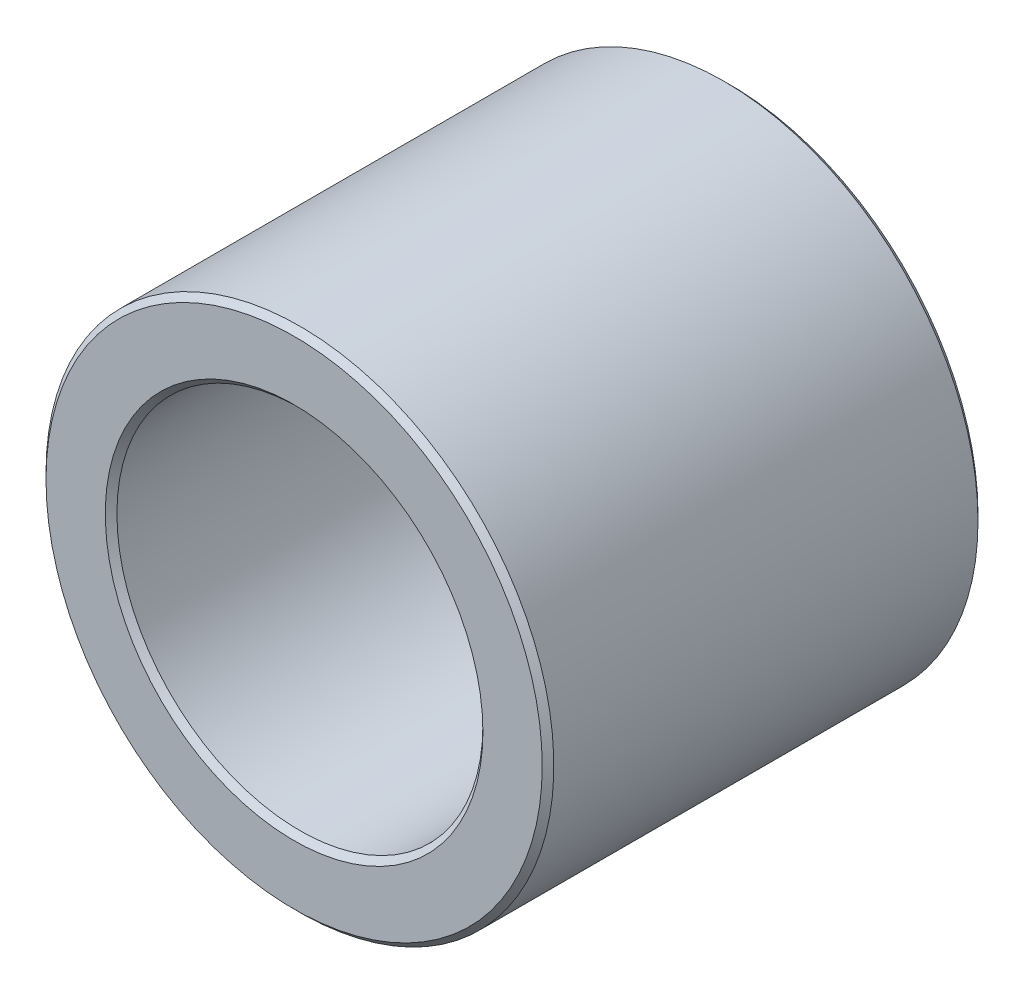
ISO-10303-21;
HEADER;
FILE_DESCRIPTION(('STEP AP214'),'2;1');
FILE_NAME('part.step','',(''),(''),'','','');
FILE_SCHEMA(('AUTOMOTIVE_DESIGN { 1 0 10303 214 1 1 1 1 }'));
ENDSEC;
DATA;
#1=APPLICATION_CONTEXT('core data for automotive mechanical design processes');
#2=APPLICATION_PROTOCOL_DEFINITION('international standard','automotive_design',2000,#1);
#3=PRODUCT_CONTEXT('',#1,'mechanical');
#4=PRODUCT('Part','Part','',(#3));
#5=PRODUCT_RELATED_PRODUCT_CATEGORY('part','',(#4));
#6=PRODUCT_DEFINITION_FORMATION('','',#4);
#7=PRODUCT_DEFINITION_CONTEXT('part definition',#1,'design');
#8=PRODUCT_DEFINITION('design','',#6,#7);
#9=PRODUCT_DEFINITION_SHAPE('','',#8);
#10=(LENGTH_UNIT() NAMED_UNIT(*) SI_UNIT(.MILLI.,.METRE.));
#11=(NAMED_UNIT(*) PLANE_ANGLE_UNIT() SI_UNIT($,.RADIAN.));
#12=(NAMED_UNIT(*) SI_UNIT($,.STERADIAN.) SOLID_ANGLE_UNIT());
#13=UNCERTAINTY_MEASURE_WITH_UNIT(LENGTH_MEASURE(1.E-05),#10,'distance_accuracy_value','');
#14=(GEOMETRIC_REPRESENTATION_CONTEXT(3) GLOBAL_UNCERTAINTY_ASSIGNED_CONTEXT((#13)) GLOBAL_UNIT_ASSIGNED_CONTEXT((#10,
#11,#12)) REPRESENTATION_CONTEXT('',''));
#15=CARTESIAN_POINT('',(0.,0.,0.));
#16=DIRECTION('',(0.,0.,1.));
#17=DIRECTION('',(1.,0.,0.));
#18=AXIS2_PLACEMENT_3D('',#15,#16,#17);
#19=CARTESIAN_POINT('',(0.,0.,9.525));
#20=DIRECTION('',(0.,0.,1.));
#21=DIRECTION('',(1.,0.,0.));
#22=AXIS2_PLACEMENT_3D('',#19,#20,#21);
#23=PLANE('',#22);
#24=CARTESIAN_POINT('',(0.,0.,9.525));
#25=DIRECTION('',(0.,0.,1.));
#26=DIRECTION('',(1.,0.,0.));
#27=AXIS2_PLACEMENT_3D('',#24,#25,#26);
#28=CIRCLE('',#27,4.12700000100001);
#29=CARTESIAN_POINT('',(4.12700000100001,0.,9.525));
#30=VERTEX_POINT('',#29);
#31=EDGE_CURVE('E59',#30,#30,#28,.F.);
#32=ORIENTED_EDGE('',*,*,#31,.T.);
#33=EDGE_LOOP('',(#32));
#34=FACE_BOUND('',#33,.T.);
#35=CARTESIAN_POINT('',(0.,0.,9.525));
#36=DIRECTION('',(0.,0.,1.));
#37=DIRECTION('',(1.,0.,0.));
#38=AXIS2_PLACEMENT_3D('',#35,#36,#37);
#39=CIRCLE('',#38,5.4229);
#40=CARTESIAN_POINT('',(5.4229,0.,9.525));
#41=VERTEX_POINT('',#40);
#42=EDGE_CURVE('E64',#41,#41,#39,.T.);
#43=ORIENTED_EDGE('',*,*,#42,.T.);
#44=EDGE_LOOP('',(#43));
#45=FACE_BOUND('',#44,.T.);
#46=ADVANCED_FACE('F45',(#34,#45),#23,.T.);
#47=CARTESIAN_POINT('',(0.,0.,0.));
#48=DIRECTION('',(0.,0.,1.));
#49=DIRECTION('',(1.,0.,0.));
#50=AXIS2_PLACEMENT_3D('',#47,#48,#49);
#51=PLANE('',#50);
#52=CARTESIAN_POINT('',(0.,0.,0.));
#53=DIRECTION('',(0.,0.,1.));
#54=DIRECTION('',(1.,0.,0.));
#55=AXIS2_PLACEMENT_3D('',#52,#53,#54);
#56=CIRCLE('',#55,4.127000001);
#57=CARTESIAN_POINT('',(4.127000001,0.,0.));
#58=VERTEX_POINT('',#57);
#59=EDGE_CURVE('E78',#58,#58,#56,.T.);
#60=ORIENTED_EDGE('',*,*,#59,.T.);
#61=EDGE_LOOP('',(#60));
#62=FACE_BOUND('',#61,.T.);
#63=CARTESIAN_POINT('',(0.,0.,0.));
#64=DIRECTION('',(0.,0.,1.));
#65=DIRECTION('',(1.,0.,0.));
#66=AXIS2_PLACEMENT_3D('',#63,#64,#65);
#67=CIRCLE('',#66,5.42289999999999);
#68=CARTESIAN_POINT('',(5.42289999999999,0.,0.));
#69=VERTEX_POINT('',#68);
#70=EDGE_CURVE('E82',#69,#69,#67,.F.);
#71=ORIENTED_EDGE('',*,*,#70,.T.);
#72=EDGE_LOOP('',(#71));
#73=FACE_BOUND('',#72,.T.);
#74=ADVANCED_FACE('F87',(#62,#73),#51,.F.);
#75=CARTESIAN_POINT('',(0.,0.,9.525));
#76=DIRECTION('',(0.,0.,-1.));
#77=DIRECTION('',(-1.,0.,0.));
#78=AXIS2_PLACEMENT_3D('',#75,#76,#77);
#79=CYLINDRICAL_SURFACE('',#78,5.5499);
#80=CARTESIAN_POINT('',(0.,0.,0.127000000000004));
#81=DIRECTION('',(0.,0.,1.));
#82=DIRECTION('',(1.,0.,0.));
#83=AXIS2_PLACEMENT_3D('',#80,#81,#82);
#84=CIRCLE('',#83,5.5499);
#85=CARTESIAN_POINT('',(-5.5499,0.,0.127000000000002));
#86=VERTEX_POINT('',#85);
#87=EDGE_CURVE('E10',#86,#86,#84,.T.);
#88=CARTESIAN_POINT('',(0.,0.,9.39800000000001));
#89=DIRECTION('',(0.,0.,1.));
#90=DIRECTION('',(1.,0.,0.));
#91=AXIS2_PLACEMENT_3D('',#88,#89,#90);
#92=CIRCLE('',#91,5.5499);
#93=CARTESIAN_POINT('',(-5.5499,0.,9.39800000000001));
#94=VERTEX_POINT('',#93);
#95=EDGE_CURVE('E54',#94,#94,#92,.F.);
#96=CARTESIAN_POINT('',(-5.5499,0.,0.127000000000002));
#97=CARTESIAN_POINT('',(-5.5499,0.,0.223572916666669));
#98=CARTESIAN_POINT('',(-5.5499,0.,0.320145833333336));
#99=CARTESIAN_POINT('',(-5.5499,0.,0.513291666666669));
#100=CARTESIAN_POINT('',(-5.5499,0.,0.609864583333336));
#101=CARTESIAN_POINT('',(-5.5499,0.,0.803010416666669));
#102=CARTESIAN_POINT('',(-5.5499,0.,0.899583333333336));
#103=CARTESIAN_POINT('',(-5.5499,0.,1.09272916666667));
#104=CARTESIAN_POINT('',(-5.5499,0.,1.18930208333334));
#105=CARTESIAN_POINT('',(-5.5499,0.,1.38244791666667));
#106=CARTESIAN_POINT('',(-5.5499,0.,1.47902083333334));
#107=CARTESIAN_POINT('',(-5.5499,0.,1.67216666666667));
#108=CARTESIAN_POINT('',(-5.5499,0.,1.76873958333334));
#109=CARTESIAN_POINT('',(-5.5499,0.,1.96188541666667));
#110=CARTESIAN_POINT('',(-5.5499,0.,2.05845833333334));
#111=CARTESIAN_POINT('',(-5.5499,0.,2.25160416666667));
#112=CARTESIAN_POINT('',(-5.5499,0.,2.34817708333334));
#113=CARTESIAN_POINT('',(-5.5499,0.,2.54132291666667));
#114=CARTESIAN_POINT('',(-5.5499,0.,2.63789583333334));
#115=CARTESIAN_POINT('',(-5.5499,0.,2.83104166666667));
#116=CARTESIAN_POINT('',(-5.5499,0.,2.92761458333334));
#117=CARTESIAN_POINT('',(-5.5499,0.,3.12076041666667));
#118=CARTESIAN_POINT('',(-5.5499,0.,3.21733333333334));
#119=CARTESIAN_POINT('',(-5.5499,0.,3.41047916666667));
#120=CARTESIAN_POINT('',(-5.5499,0.,3.50705208333334));
#121=CARTESIAN_POINT('',(-5.5499,0.,3.70019791666667));
#122=CARTESIAN_POINT('',(-5.5499,0.,3.79677083333334));
#123=CARTESIAN_POINT('',(-5.5499,0.,3.98991666666667));
#124=CARTESIAN_POINT('',(-5.5499,0.,4.08648958333334));
#125=CARTESIAN_POINT('',(-5.5499,0.,4.27963541666667));
#126=CARTESIAN_POINT('',(-5.5499,0.,4.37620833333334));
#127=CARTESIAN_POINT('',(-5.5499,0.,4.56935416666667));
#128=CARTESIAN_POINT('',(-5.5499,0.,4.66592708333334));
#129=CARTESIAN_POINT('',(-5.5499,0.,4.85907291666667));
#130=CARTESIAN_POINT('',(-5.5499,0.,4.95564583333334));
#131=CARTESIAN_POINT('',(-5.5499,0.,5.14879166666667));
#132=CARTESIAN_POINT('',(-5.5499,0.,5.24536458333334));
#133=CARTESIAN_POINT('',(-5.5499,0.,5.43851041666667));
#134=CARTESIAN_POINT('',(-5.5499,0.,5.53508333333334));
#135=CARTESIAN_POINT('',(-5.5499,0.,5.72822916666667));
#136=CARTESIAN_POINT('',(-5.5499,0.,5.82480208333334));
#137=CARTESIAN_POINT('',(-5.5499,0.,6.01794791666667));
#138=CARTESIAN_POINT('',(-5.5499,0.,6.11452083333334));
#139=CARTESIAN_POINT('',(-5.5499,0.,6.30766666666667));
#140=CARTESIAN_POINT('',(-5.5499,0.,6.40423958333334));
#141=CARTESIAN_POINT('',(-5.5499,0.,6.59738541666667));
#142=CARTESIAN_POINT('',(-5.5499,0.,6.69395833333334));
#143=CARTESIAN_POINT('',(-5.5499,0.,6.88710416666667));
#144=CARTESIAN_POINT('',(-5.5499,0.,6.98367708333334));
#145=CARTESIAN_POINT('',(-5.5499,0.,7.17682291666667));
#146=CARTESIAN_POINT('',(-5.5499,0.,7.27339583333334));
#147=CARTESIAN_POINT('',(-5.5499,0.,7.46654166666667));
#148=CARTESIAN_POINT('',(-5.5499,0.,7.56311458333334));
#149=CARTESIAN_POINT('',(-5.5499,0.,7.75626041666667));
#150=CARTESIAN_POINT('',(-5.5499,0.,7.85283333333334));
#151=CARTESIAN_POINT('',(-5.5499,0.,8.04597916666667));
#152=CARTESIAN_POINT('',(-5.5499,0.,8.14255208333334));
#153=CARTESIAN_POINT('',(-5.5499,0.,8.33569791666667));
#154=CARTESIAN_POINT('',(-5.5499,0.,8.43227083333334));
#155=CARTESIAN_POINT('',(-5.5499,0.,8.62541666666667));
#156=CARTESIAN_POINT('',(-5.5499,0.,8.72198958333334));
#157=CARTESIAN_POINT('',(-5.5499,0.,8.91513541666667));
#158=CARTESIAN_POINT('',(-5.5499,0.,9.01170833333334));
#159=CARTESIAN_POINT('',(-5.5499,0.,9.20485416666667));
#160=CARTESIAN_POINT('',(-5.5499,0.,9.30142708333334));
#161=CARTESIAN_POINT('',(-5.5499,0.,9.39800000000001));
#162=B_SPLINE_CURVE_WITH_KNOTS('',3,(#96,#97,#98,#99,#100,#101,#102,#103,#104,#105,#106,#107,
#108,#109,#110,#111,#112,#113,#114,#115,#116,#117,#118,#119,#120,#121,#122,#123,#124,#125,#126,
#127,#128,#129,#130,#131,#132,#133,#134,#135,#136,#137,#138,#139,#140,#141,#142,#143,#144,#145,
#146,#147,#148,#149,#150,#151,#152,#153,#154,#155,#156,#157,#158,#159,#160,#161),.UNSPECIFIED.,
.F.,.F.,(4,2,2,2,2,2,2,2,2,2,2,2,2,2,2,2,2,2,2,2,2,2,2,2,2,2,2,2,2,2,2,2,4),(0.,
0.289718750000001,0.5794375,0.869156250000001,1.158875,1.44859375,1.7383125,2.02803125,2.31775,
2.60746875,2.8971875,3.18690625,3.476625,3.76634375,4.0560625,4.34578125,4.6355,4.92521875,
5.2149375,5.50465625,5.794375,6.08409375,6.3738125,6.66353125,6.95325,7.24296875,7.5326875,
7.82240625,8.112125,8.40184375,8.6915625,8.98128125,9.271),.UNSPECIFIED.);
#163=EDGE_CURVE('BSEAM108',#86,#94,#162,.T.);
#164=ORIENTED_EDGE('',*,*,#87,.T.);
#165=ORIENTED_EDGE('',*,*,#95,.T.);
#166=ORIENTED_EDGE('',*,*,#163,.T.);
#167=ORIENTED_EDGE('',*,*,#163,.F.);
#168=EDGE_LOOP('',(#164,#166,#165,#167));
#169=FACE_BOUND('',#168,.T.);
#170=ADVANCED_FACE('F108',(#169),#79,.T.);
#171=CARTESIAN_POINT('',(0.,0.,9.525));
#172=DIRECTION('',(0.,0.,-1.));
#173=DIRECTION('',(-1.,0.,0.));
#174=AXIS2_PLACEMENT_3D('',#171,#172,#173);
#175=CYLINDRICAL_SURFACE('',#174,4.000000001);
#176=CARTESIAN_POINT('',(0.,0.,0.126999999999997));
#177=DIRECTION('',(0.,0.,1.));
#178=DIRECTION('',(1.,0.,0.));
#179=AXIS2_PLACEMENT_3D('',#176,#177,#178);
#180=CIRCLE('',#179,4.000000001);
#181=CARTESIAN_POINT('',(-4.000000001,0.,0.126999999999995));
#182=VERTEX_POINT('',#181);
#183=EDGE_CURVE('E70',#182,#182,#180,.F.);
#184=CARTESIAN_POINT('',(0.,0.,9.39799999999999));
#185=DIRECTION('',(0.,0.,1.));
#186=DIRECTION('',(1.,0.,0.));
#187=AXIS2_PLACEMENT_3D('',#184,#185,#186);
#188=CIRCLE('',#187,4.000000001);
#189=CARTESIAN_POINT('',(-4.000000001,0.,9.39799999999999));
#190=VERTEX_POINT('',#189);
#191=EDGE_CURVE('E74',#190,#190,#188,.T.);
#192=CARTESIAN_POINT('',(-4.000000001,0.,0.126999999999995));
#193=CARTESIAN_POINT('',(-4.000000001,0.,0.223572916666662));
#194=CARTESIAN_POINT('',(-4.000000001,0.,0.320145833333328));
#195=CARTESIAN_POINT('',(-4.000000001,0.,0.513291666666661));
#196=CARTESIAN_POINT('',(-4.000000001,0.,0.609864583333328));
#197=CARTESIAN_POINT('',(-4.000000001,0.,0.803010416666662));
#198=CARTESIAN_POINT('',(-4.000000001,0.,0.899583333333328));
#199=CARTESIAN_POINT('',(-4.000000001,0.,1.09272916666666));
#200=CARTESIAN_POINT('',(-4.000000001,0.,1.18930208333333));
#201=CARTESIAN_POINT('',(-4.000000001,0.,1.38244791666666));
#202=CARTESIAN_POINT('',(-4.000000001,0.,1.47902083333333));
#203=CARTESIAN_POINT('',(-4.000000001,0.,1.67216666666666));
#204=CARTESIAN_POINT('',(-4.000000001,0.,1.76873958333333));
#205=CARTESIAN_POINT('',(-4.000000001,0.,1.96188541666666));
#206=CARTESIAN_POINT('',(-4.000000001,0.,2.05845833333333));
#207=CARTESIAN_POINT('',(-4.000000001,0.,2.25160416666666));
#208=CARTESIAN_POINT('',(-4.000000001,0.,2.34817708333333));
#209=CARTESIAN_POINT('',(-4.000000001,0.,2.54132291666666));
#210=CARTESIAN_POINT('',(-4.000000001,0.,2.63789583333333));
#211=CARTESIAN_POINT('',(-4.000000001,0.,2.83104166666666));
#212=CARTESIAN_POINT('',(-4.000000001,0.,2.92761458333333));
#213=CARTESIAN_POINT('',(-4.000000001,0.,3.12076041666666));
#214=CARTESIAN_POINT('',(-4.000000001,0.,3.21733333333333));
#215=CARTESIAN_POINT('',(-4.000000001,0.,3.41047916666666));
#216=CARTESIAN_POINT('',(-4.000000001,0.,3.50705208333333));
#217=CARTESIAN_POINT('',(-4.000000001,0.,3.70019791666666));
#218=CARTESIAN_POINT('',(-4.000000001,0.,3.79677083333333));
#219=CARTESIAN_POINT('',(-4.000000001,0.,3.98991666666666));
#220=CARTESIAN_POINT('',(-4.000000001,0.,4.08648958333333));
#221=CARTESIAN_POINT('',(-4.000000001,0.,4.27963541666666));
#222=CARTESIAN_POINT('',(-4.000000001,0.,4.37620833333332));
#223=CARTESIAN_POINT('',(-4.000000001,0.,4.56935416666666));
#224=CARTESIAN_POINT('',(-4.000000001,0.,4.66592708333333));
#225=CARTESIAN_POINT('',(-4.000000001,0.,4.85907291666666));
#226=CARTESIAN_POINT('',(-4.000000001,0.,4.95564583333332));
#227=CARTESIAN_POINT('',(-4.000000001,0.,5.14879166666666));
#228=CARTESIAN_POINT('',(-4.000000001,0.,5.24536458333333));
#229=CARTESIAN_POINT('',(-4.000000001,0.,5.43851041666666));
#230=CARTESIAN_POINT('',(-4.000000001,0.,5.53508333333332));
#231=CARTESIAN_POINT('',(-4.000000001,0.,5.72822916666666));
#232=CARTESIAN_POINT('',(-4.000000001,0.,5.82480208333332));
#233=CARTESIAN_POINT('',(-4.000000001,0.,6.01794791666666));
#234=CARTESIAN_POINT('',(-4.000000001,0.,6.11452083333332));
#235=CARTESIAN_POINT('',(-4.000000001,0.,6.30766666666666));
#236=CARTESIAN_POINT('',(-4.000000001,0.,6.40423958333332));
#237=CARTESIAN_POINT('',(-4.000000001,0.,6.59738541666666));
#238=CARTESIAN_POINT('',(-4.000000001,0.,6.69395833333332));
#239=CARTESIAN_POINT('',(-4.000000001,0.,6.88710416666666));
#240=CARTESIAN_POINT('',(-4.000000001,0.,6.98367708333332));
#241=CARTESIAN_POINT('',(-4.000000001,0.,7.17682291666666));
#242=CARTESIAN_POINT('',(-4.000000001,0.,7.27339583333332));
#243=CARTESIAN_POINT('',(-4.000000001,0.,7.46654166666666));
#244=CARTESIAN_POINT('',(-4.000000001,0.,7.56311458333332));
#245=CARTESIAN_POINT('',(-4.000000001,0.,7.75626041666666));
#246=CARTESIAN_POINT('',(-4.000000001,0.,7.85283333333332));
#247=CARTESIAN_POINT('',(-4.000000001,0.,8.04597916666665));
#248=CARTESIAN_POINT('',(-4.000000001,0.,8.14255208333332));
#249=CARTESIAN_POINT('',(-4.000000001,0.,8.33569791666666));
#250=CARTESIAN_POINT('',(-4.000000001,0.,8.43227083333332));
#251=CARTESIAN_POINT('',(-4.000000001,0.,8.62541666666665));
#252=CARTESIAN_POINT('',(-4.000000001,0.,8.72198958333332));
#253=CARTESIAN_POINT('',(-4.000000001,0.,8.91513541666666));
#254=CARTESIAN_POINT('',(-4.000000001,0.,9.01170833333332));
#255=CARTESIAN_POINT('',(-4.000000001,0.,9.20485416666665));
#256=CARTESIAN_POINT('',(-4.000000001,0.,9.30142708333332));
#257=CARTESIAN_POINT('',(-4.000000001,0.,9.39799999999999));
#258=B_SPLINE_CURVE_WITH_KNOTS('',3,(#192,#193,#194,#195,#196,#197,#198,#199,#200,#201,#202,
#203,#204,#205,#206,#207,#208,#209,#210,#211,#212,#213,#214,#215,#216,#217,#218,#219,#220,#221,
#222,#223,#224,#225,#226,#227,#228,#229,#230,#231,#232,#233,#234,#235,#236,#237,#238,#239,#240,
#241,#242,#243,#244,#245,#246,#247,#248,#249,#250,#251,#252,#253,#254,#255,#256,#257),
.UNSPECIFIED.,.F.,.F.,(4,2,2,2,2,2,2,2,2,2,2,2,2,2,2,2,2,2,2,2,2,2,2,2,2,2,2,2,2,2,2,2,4),(0.,
0.289718749999999,0.5794375,0.869156249999999,1.158875,1.44859375,1.7383125,2.02803125,2.31775,
2.60746875,2.8971875,3.18690625,3.476625,3.76634375,4.0560625,4.34578125,4.6355,4.92521875,
5.2149375,5.50465624999999,5.794375,6.08409374999999,6.37381249999999,6.66353124999999,
6.95324999999999,7.24296874999999,7.53268749999999,7.82240624999999,8.11212499999999,
8.40184374999999,8.69156249999999,8.98128124999999,9.27099999999999),.UNSPECIFIED.);
#259=EDGE_CURVE('BSEAM113',#182,#190,#258,.T.);
#260=ORIENTED_EDGE('',*,*,#183,.T.);
#261=ORIENTED_EDGE('',*,*,#191,.T.);
#262=ORIENTED_EDGE('',*,*,#259,.T.);
#263=ORIENTED_EDGE('',*,*,#259,.F.);
#264=EDGE_LOOP('',(#260,#262,#261,#263));
#265=FACE_BOUND('',#264,.T.);
#266=ADVANCED_FACE('F113',(#265),#175,.F.);
#267=CARTESIAN_POINT('',(0.,0.,0.));
#268=DIRECTION('',(0.,0.,-1.));
#269=DIRECTION('',(-1.,0.,0.));
#270=AXIS2_PLACEMENT_3D('',#267,#268,#269);
#271=CONICAL_SURFACE('',#270,4.127000001,0.785398163397445);
#272=ORIENTED_EDGE('',*,*,#183,.F.);
#273=EDGE_LOOP('',(#272));
#274=FACE_BOUND('',#273,.T.);
#275=ORIENTED_EDGE('',*,*,#59,.F.);
#276=EDGE_LOOP('',(#275));
#277=FACE_BOUND('',#276,.T.);
#278=ADVANCED_FACE('F98',(#274,#277),#271,.F.);
#279=CARTESIAN_POINT('',(0.,0.,9.39799999999999));
#280=DIRECTION('',(0.,0.,1.));
#281=DIRECTION('',(1.,0.,0.));
#282=AXIS2_PLACEMENT_3D('',#279,#280,#281);
#283=CONICAL_SURFACE('',#282,4.000000001,0.785398163397438);
#284=ORIENTED_EDGE('',*,*,#31,.F.);
#285=EDGE_LOOP('',(#284));
#286=FACE_BOUND('',#285,.T.);
#287=ORIENTED_EDGE('',*,*,#191,.F.);
#288=EDGE_LOOP('',(#287));
#289=FACE_BOUND('',#288,.T.);
#290=ADVANCED_FACE('F92',(#286,#289),#283,.F.);
#291=CARTESIAN_POINT('',(0.,0.,0.127000000000004));
#292=DIRECTION('',(0.,0.,1.));
#293=DIRECTION('',(1.,0.,0.));
#294=AXIS2_PLACEMENT_3D('',#291,#292,#293);
#295=CONICAL_SURFACE('',#294,5.5499,0.785398163397452);
#296=ORIENTED_EDGE('',*,*,#70,.F.);
#297=EDGE_LOOP('',(#296));
#298=FACE_BOUND('',#297,.T.);
#299=ORIENTED_EDGE('',*,*,#87,.F.);
#300=EDGE_LOOP('',(#299));
#301=FACE_BOUND('',#300,.T.);
#302=ADVANCED_FACE('F89',(#298,#301),#295,.T.);
#303=CARTESIAN_POINT('',(0.,0.,9.525));
#304=DIRECTION('',(0.,0.,-1.));
#305=DIRECTION('',(-1.,0.,0.));
#306=AXIS2_PLACEMENT_3D('',#303,#304,#305);
#307=CONICAL_SURFACE('',#306,5.4229,0.785398163397445);
#308=ORIENTED_EDGE('',*,*,#95,.F.);
#309=EDGE_LOOP('',(#308));
#310=FACE_BOUND('',#309,.T.);
#311=ORIENTED_EDGE('',*,*,#42,.F.);
#312=EDGE_LOOP('',(#311));
#313=FACE_BOUND('',#312,.T.);
#314=ADVANCED_FACE('F48',(#310,#313),#307,.T.);
#315=CLOSED_SHELL('',(#46,#74,#170,#266,#278,#290,#302,#314));
#316=MANIFOLD_SOLID_BREP('B2',#315);
#317=ADVANCED_BREP_SHAPE_REPRESENTATION('',(#18,#316),#14);
#318=SHAPE_DEFINITION_REPRESENTATION(#9,#317);
ENDSEC;
END-ISO-10303-21;
